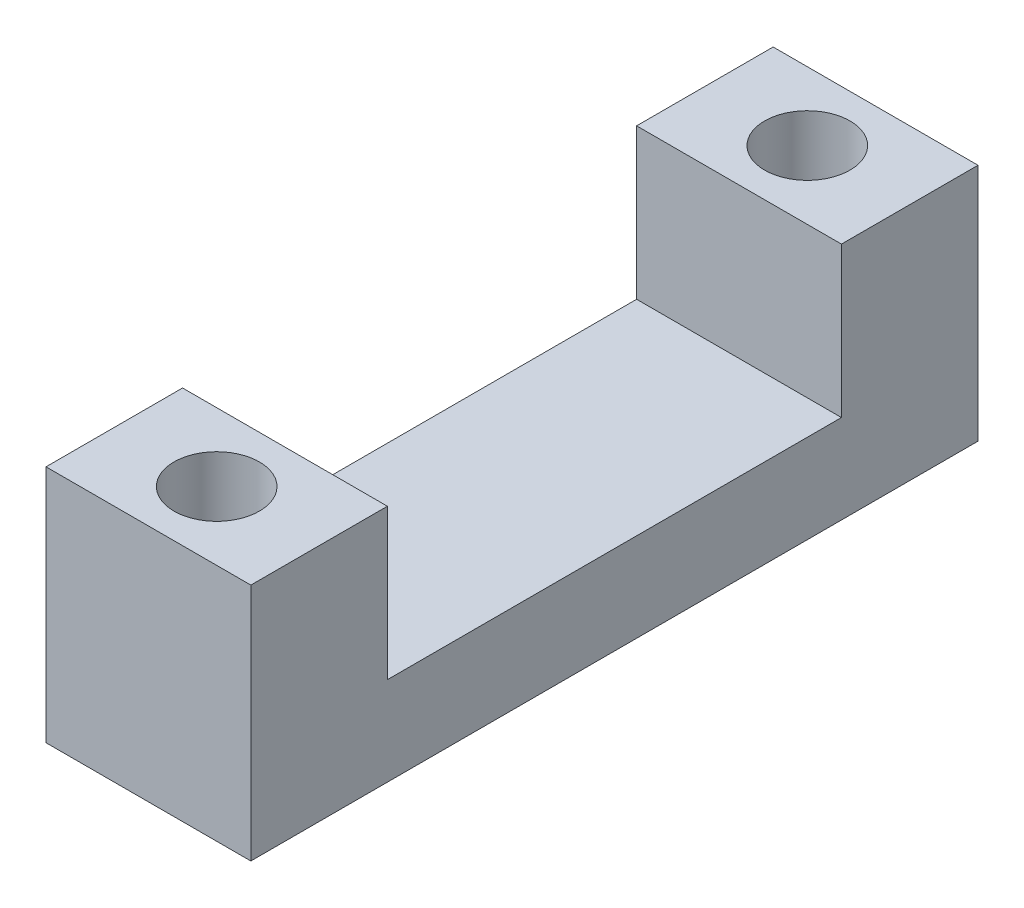
ISO-10303-21;
HEADER;
FILE_DESCRIPTION(('STEP AP214'),'2;1');
FILE_NAME('part.step','',(''),(''),'','','');
FILE_SCHEMA(('AUTOMOTIVE_DESIGN { 1 0 10303 214 1 1 1 1 }'));
ENDSEC;
DATA;
#1=APPLICATION_CONTEXT('core data for automotive mechanical design processes');
#2=APPLICATION_PROTOCOL_DEFINITION('international standard','automotive_design',2000,#1);
#3=PRODUCT_CONTEXT('',#1,'mechanical');
#4=PRODUCT('Part','Part','',(#3));
#5=PRODUCT_RELATED_PRODUCT_CATEGORY('part','',(#4));
#6=PRODUCT_DEFINITION_FORMATION('','',#4);
#7=PRODUCT_DEFINITION_CONTEXT('part definition',#1,'design');
#8=PRODUCT_DEFINITION('design','',#6,#7);
#9=PRODUCT_DEFINITION_SHAPE('','',#8);
#10=(LENGTH_UNIT() NAMED_UNIT(*) SI_UNIT(.MILLI.,.METRE.));
#11=(NAMED_UNIT(*) PLANE_ANGLE_UNIT() SI_UNIT($,.RADIAN.));
#12=(NAMED_UNIT(*) SI_UNIT($,.STERADIAN.) SOLID_ANGLE_UNIT());
#13=UNCERTAINTY_MEASURE_WITH_UNIT(LENGTH_MEASURE(1.E-05),#10,'distance_accuracy_value','');
#14=(GEOMETRIC_REPRESENTATION_CONTEXT(3) GLOBAL_UNCERTAINTY_ASSIGNED_CONTEXT((#13)) GLOBAL_UNIT_ASSIGNED_CONTEXT((#10,
#11,#12)) REPRESENTATION_CONTEXT('',''));
#15=CARTESIAN_POINT('',(0.,0.,0.));
#16=DIRECTION('',(0.,0.,1.));
#17=DIRECTION('',(1.,0.,0.));
#18=AXIS2_PLACEMENT_3D('',#15,#16,#17);
#19=CARTESIAN_POINT('',(6.,0.,-21.3));
#20=DIRECTION('',(0.,1.,0.));
#21=DIRECTION('',(0.,0.,1.));
#22=AXIS2_PLACEMENT_3D('',#19,#20,#21);
#23=PLANE('',#22);
#24=CARTESIAN_POINT('',(3.,0.,-2.));
#25=DIRECTION('',(0.,1.,0.));
#26=DIRECTION('',(0.,0.,1.));
#27=AXIS2_PLACEMENT_3D('',#24,#25,#26);
#28=CIRCLE('',#27,1.25);
#29=CARTESIAN_POINT('',(3.,0.,-0.750000000000001));
#30=VERTEX_POINT('',#29);
#31=EDGE_CURVE('E188',#30,#30,#28,.T.);
#32=ORIENTED_EDGE('',*,*,#31,.T.);
#33=EDGE_LOOP('',(#32));
#34=FACE_BOUND('',#33,.T.);
#35=CARTESIAN_POINT('',(3.,0.,-19.3));
#36=DIRECTION('',(0.,1.,0.));
#37=DIRECTION('',(0.,0.,1.));
#38=AXIS2_PLACEMENT_3D('',#35,#36,#37);
#39=CIRCLE('',#38,1.25);
#40=CARTESIAN_POINT('',(3.,0.,-18.05));
#41=VERTEX_POINT('',#40);
#42=EDGE_CURVE('E139',#41,#41,#39,.T.);
#43=ORIENTED_EDGE('',*,*,#42,.T.);
#44=EDGE_LOOP('',(#43));
#45=FACE_BOUND('',#44,.T.);
#46=DIRECTION('',(0.,0.,-1.));
#47=VECTOR('',#46,1.);
#48=CARTESIAN_POINT('',(0.,0.,-21.3));
#49=LINE('',#48,#47);
#50=CARTESIAN_POINT('',(0.,0.,0.));
#51=VERTEX_POINT('',#50);
#52=CARTESIAN_POINT('',(0.,0.,-21.3));
#53=VERTEX_POINT('',#52);
#54=EDGE_CURVE('E135',#51,#53,#49,.T.);
#55=ORIENTED_EDGE('',*,*,#54,.T.);
#56=DIRECTION('',(-1.,0.,0.));
#57=VECTOR('',#56,1.);
#58=CARTESIAN_POINT('',(6.,0.,-21.3));
#59=LINE('',#58,#57);
#60=CARTESIAN_POINT('',(6.,0.,-21.3));
#61=VERTEX_POINT('',#60);
#62=EDGE_CURVE('E11',#61,#53,#59,.T.);
#63=ORIENTED_EDGE('',*,*,#62,.F.);
#64=DIRECTION('',(0.,0.,-1.));
#65=VECTOR('',#64,1.);
#66=CARTESIAN_POINT('',(6.,0.,-21.3));
#67=LINE('',#66,#65);
#68=CARTESIAN_POINT('',(6.,0.,0.));
#69=VERTEX_POINT('',#68);
#70=EDGE_CURVE('E150',#69,#61,#67,.T.);
#71=ORIENTED_EDGE('',*,*,#70,.F.);
#72=DIRECTION('',(-1.,0.,0.));
#73=VECTOR('',#72,1.);
#74=CARTESIAN_POINT('',(6.,0.,0.));
#75=LINE('',#74,#73);
#76=EDGE_CURVE('E131',#69,#51,#75,.T.);
#77=ORIENTED_EDGE('',*,*,#76,.T.);
#78=EDGE_LOOP('',(#55,#63,#71,#77));
#79=FACE_BOUND('',#78,.T.);
#80=ADVANCED_FACE('F39',(#34,#45,#79),#23,.F.);
#81=CARTESIAN_POINT('',(6.,7.,-21.3));
#82=DIRECTION('',(0.,0.,1.));
#83=DIRECTION('',(0.,-1.,0.));
#84=AXIS2_PLACEMENT_3D('',#81,#82,#83);
#85=PLANE('',#84);
#86=DIRECTION('',(0.,1.,0.));
#87=VECTOR('',#86,1.);
#88=CARTESIAN_POINT('',(0.,7.,-21.3));
#89=LINE('',#88,#87);
#90=CARTESIAN_POINT('',(0.,7.,-21.3));
#91=VERTEX_POINT('',#90);
#92=EDGE_CURVE('E138',#53,#91,#89,.T.);
#93=ORIENTED_EDGE('',*,*,#92,.T.);
#94=DIRECTION('',(-1.,0.,0.));
#95=VECTOR('',#94,1.);
#96=CARTESIAN_POINT('',(6.,7.,-21.3));
#97=LINE('',#96,#95);
#98=CARTESIAN_POINT('',(6.,7.,-21.3));
#99=VERTEX_POINT('',#98);
#100=EDGE_CURVE('E47',#99,#91,#97,.T.);
#101=ORIENTED_EDGE('',*,*,#100,.F.);
#102=DIRECTION('',(0.,1.,0.));
#103=VECTOR('',#102,1.);
#104=CARTESIAN_POINT('',(6.,7.,-21.3));
#105=LINE('',#104,#103);
#106=EDGE_CURVE('E98',#61,#99,#105,.T.);
#107=ORIENTED_EDGE('',*,*,#106,.F.);
#108=ORIENTED_EDGE('',*,*,#62,.T.);
#109=EDGE_LOOP('',(#93,#101,#107,#108));
#110=FACE_BOUND('',#109,.T.);
#111=ADVANCED_FACE('F207',(#110),#85,.F.);
#112=CARTESIAN_POINT('',(6.,7.,-17.3));
#113=DIRECTION('',(0.,-1.,0.));
#114=DIRECTION('',(0.,0.,-1.));
#115=AXIS2_PLACEMENT_3D('',#112,#113,#114);
#116=PLANE('',#115);
#117=CARTESIAN_POINT('',(3.,7.,-19.3));
#118=DIRECTION('',(0.,1.,0.));
#119=DIRECTION('',(0.,0.,1.));
#120=AXIS2_PLACEMENT_3D('',#117,#118,#119);
#121=CIRCLE('',#120,1.25);
#122=CARTESIAN_POINT('',(3.,7.,-18.05));
#123=VERTEX_POINT('',#122);
#124=EDGE_CURVE('E185',#123,#123,#121,.T.);
#125=ORIENTED_EDGE('',*,*,#124,.F.);
#126=EDGE_LOOP('',(#125));
#127=FACE_BOUND('',#126,.T.);
#128=DIRECTION('',(0.,0.,1.));
#129=VECTOR('',#128,1.);
#130=CARTESIAN_POINT('',(0.,7.,-17.3));
#131=LINE('',#130,#129);
#132=CARTESIAN_POINT('',(0.,7.,-17.3));
#133=VERTEX_POINT('',#132);
#134=EDGE_CURVE('E141',#91,#133,#131,.T.);
#135=ORIENTED_EDGE('',*,*,#134,.T.);
#136=DIRECTION('',(-1.,0.,0.));
#137=VECTOR('',#136,1.);
#138=CARTESIAN_POINT('',(6.,7.,-17.3));
#139=LINE('',#138,#137);
#140=CARTESIAN_POINT('',(6.,7.,-17.3));
#141=VERTEX_POINT('',#140);
#142=EDGE_CURVE('E157',#141,#133,#139,.T.);
#143=ORIENTED_EDGE('',*,*,#142,.F.);
#144=DIRECTION('',(0.,0.,1.));
#145=VECTOR('',#144,1.);
#146=CARTESIAN_POINT('',(6.,7.,-17.3));
#147=LINE('',#146,#145);
#148=EDGE_CURVE('E165',#99,#141,#147,.T.);
#149=ORIENTED_EDGE('',*,*,#148,.F.);
#150=ORIENTED_EDGE('',*,*,#100,.T.);
#151=EDGE_LOOP('',(#135,#143,#149,#150));
#152=FACE_BOUND('',#151,.T.);
#153=ADVANCED_FACE('F163',(#127,#152),#116,.F.);
#154=CARTESIAN_POINT('',(6.,2.6,-17.3));
#155=DIRECTION('',(0.,0.,-1.));
#156=DIRECTION('',(-1.,0.,0.));
#157=AXIS2_PLACEMENT_3D('',#154,#155,#156);
#158=PLANE('',#157);
#159=DIRECTION('',(0.,-1.,0.));
#160=VECTOR('',#159,1.);
#161=CARTESIAN_POINT('',(0.,2.6,-17.3));
#162=LINE('',#161,#160);
#163=CARTESIAN_POINT('',(0.,2.6,-17.3));
#164=VERTEX_POINT('',#163);
#165=EDGE_CURVE('E143',#133,#164,#162,.T.);
#166=ORIENTED_EDGE('',*,*,#165,.T.);
#167=DIRECTION('',(-1.,0.,0.));
#168=VECTOR('',#167,1.);
#169=CARTESIAN_POINT('',(6.,2.6,-17.3));
#170=LINE('',#169,#168);
#171=CARTESIAN_POINT('',(6.,2.6,-17.3));
#172=VERTEX_POINT('',#171);
#173=EDGE_CURVE('E154',#172,#164,#170,.T.);
#174=ORIENTED_EDGE('',*,*,#173,.F.);
#175=DIRECTION('',(0.,-1.,0.));
#176=VECTOR('',#175,1.);
#177=CARTESIAN_POINT('',(6.,2.6,-17.3));
#178=LINE('',#177,#176);
#179=EDGE_CURVE('E177',#141,#172,#178,.T.);
#180=ORIENTED_EDGE('',*,*,#179,.F.);
#181=ORIENTED_EDGE('',*,*,#142,.T.);
#182=EDGE_LOOP('',(#166,#174,#180,#181));
#183=FACE_BOUND('',#182,.T.);
#184=ADVANCED_FACE('F173',(#183),#158,.F.);
#185=CARTESIAN_POINT('',(6.,2.6,-4.));
#186=DIRECTION('',(0.,-1.,0.));
#187=DIRECTION('',(0.,0.,-1.));
#188=AXIS2_PLACEMENT_3D('',#185,#186,#187);
#189=PLANE('',#188);
#190=DIRECTION('',(0.,0.,1.));
#191=VECTOR('',#190,1.);
#192=CARTESIAN_POINT('',(0.,2.6,-4.));
#193=LINE('',#192,#191);
#194=CARTESIAN_POINT('',(0.,2.6,-4.));
#195=VERTEX_POINT('',#194);
#196=EDGE_CURVE('E145',#164,#195,#193,.T.);
#197=ORIENTED_EDGE('',*,*,#196,.T.);
#198=DIRECTION('',(-1.,0.,0.));
#199=VECTOR('',#198,1.);
#200=CARTESIAN_POINT('',(6.,2.6,-4.));
#201=LINE('',#200,#199);
#202=CARTESIAN_POINT('',(6.,2.6,-4.));
#203=VERTEX_POINT('',#202);
#204=EDGE_CURVE('E126',#203,#195,#201,.T.);
#205=ORIENTED_EDGE('',*,*,#204,.F.);
#206=DIRECTION('',(0.,0.,1.));
#207=VECTOR('',#206,1.);
#208=CARTESIAN_POINT('',(6.,2.6,-4.));
#209=LINE('',#208,#207);
#210=EDGE_CURVE('E117',#172,#203,#209,.T.);
#211=ORIENTED_EDGE('',*,*,#210,.F.);
#212=ORIENTED_EDGE('',*,*,#173,.T.);
#213=EDGE_LOOP('',(#197,#205,#211,#212));
#214=FACE_BOUND('',#213,.T.);
#215=ADVANCED_FACE('F176',(#214),#189,.F.);
#216=CARTESIAN_POINT('',(6.,7.,-4.));
#217=DIRECTION('',(0.,0.,1.));
#218=DIRECTION('',(0.,-1.,0.));
#219=AXIS2_PLACEMENT_3D('',#216,#217,#218);
#220=PLANE('',#219);
#221=DIRECTION('',(0.,1.,0.));
#222=VECTOR('',#221,1.);
#223=CARTESIAN_POINT('',(0.,7.,-4.));
#224=LINE('',#223,#222);
#225=CARTESIAN_POINT('',(0.,7.,-4.));
#226=VERTEX_POINT('',#225);
#227=EDGE_CURVE('E125',#195,#226,#224,.T.);
#228=ORIENTED_EDGE('',*,*,#227,.T.);
#229=DIRECTION('',(-1.,0.,0.));
#230=VECTOR('',#229,1.);
#231=CARTESIAN_POINT('',(6.,7.,-4.));
#232=LINE('',#231,#230);
#233=CARTESIAN_POINT('',(6.,7.,-4.));
#234=VERTEX_POINT('',#233);
#235=EDGE_CURVE('E122',#234,#226,#232,.T.);
#236=ORIENTED_EDGE('',*,*,#235,.F.);
#237=DIRECTION('',(0.,1.,0.));
#238=VECTOR('',#237,1.);
#239=CARTESIAN_POINT('',(6.,7.,-4.));
#240=LINE('',#239,#238);
#241=EDGE_CURVE('E111',#203,#234,#240,.T.);
#242=ORIENTED_EDGE('',*,*,#241,.F.);
#243=ORIENTED_EDGE('',*,*,#204,.T.);
#244=EDGE_LOOP('',(#228,#236,#242,#243));
#245=FACE_BOUND('',#244,.T.);
#246=ADVANCED_FACE('F123',(#245),#220,.F.);
#247=CARTESIAN_POINT('',(6.,7.,0.));
#248=DIRECTION('',(0.,-1.,0.));
#249=DIRECTION('',(0.,0.,-1.));
#250=AXIS2_PLACEMENT_3D('',#247,#248,#249);
#251=PLANE('',#250);
#252=CARTESIAN_POINT('',(3.,7.,-2.));
#253=DIRECTION('',(0.,1.,0.));
#254=DIRECTION('',(0.,0.,1.));
#255=AXIS2_PLACEMENT_3D('',#252,#253,#254);
#256=CIRCLE('',#255,1.25);
#257=CARTESIAN_POINT('',(3.,7.,-0.750000000000001));
#258=VERTEX_POINT('',#257);
#259=EDGE_CURVE('E191',#258,#258,#256,.T.);
#260=ORIENTED_EDGE('',*,*,#259,.F.);
#261=EDGE_LOOP('',(#260));
#262=FACE_BOUND('',#261,.T.);
#263=DIRECTION('',(0.,0.,1.));
#264=VECTOR('',#263,1.);
#265=CARTESIAN_POINT('',(0.,7.,0.));
#266=LINE('',#265,#264);
#267=CARTESIAN_POINT('',(0.,7.,0.));
#268=VERTEX_POINT('',#267);
#269=EDGE_CURVE('E84',#226,#268,#266,.T.);
#270=ORIENTED_EDGE('',*,*,#269,.T.);
#271=DIRECTION('',(-1.,0.,0.));
#272=VECTOR('',#271,1.);
#273=CARTESIAN_POINT('',(6.,7.,0.));
#274=LINE('',#273,#272);
#275=CARTESIAN_POINT('',(6.,7.,0.));
#276=VERTEX_POINT('',#275);
#277=EDGE_CURVE('E127',#276,#268,#274,.T.);
#278=ORIENTED_EDGE('',*,*,#277,.F.);
#279=DIRECTION('',(0.,0.,1.));
#280=VECTOR('',#279,1.);
#281=CARTESIAN_POINT('',(6.,7.,0.));
#282=LINE('',#281,#280);
#283=EDGE_CURVE('E115',#234,#276,#282,.T.);
#284=ORIENTED_EDGE('',*,*,#283,.F.);
#285=ORIENTED_EDGE('',*,*,#235,.T.);
#286=EDGE_LOOP('',(#270,#278,#284,#285));
#287=FACE_BOUND('',#286,.T.);
#288=ADVANCED_FACE('F129',(#262,#287),#251,.F.);
#289=CARTESIAN_POINT('',(6.,0.,0.));
#290=DIRECTION('',(0.,0.,-1.));
#291=DIRECTION('',(0.,1.,0.));
#292=AXIS2_PLACEMENT_3D('',#289,#290,#291);
#293=PLANE('',#292);
#294=DIRECTION('',(0.,-1.,0.));
#295=VECTOR('',#294,1.);
#296=CARTESIAN_POINT('',(0.,0.,0.));
#297=LINE('',#296,#295);
#298=EDGE_CURVE('E90',#268,#51,#297,.T.);
#299=ORIENTED_EDGE('',*,*,#298,.T.);
#300=ORIENTED_EDGE('',*,*,#76,.F.);
#301=DIRECTION('',(0.,-1.,0.));
#302=VECTOR('',#301,1.);
#303=CARTESIAN_POINT('',(6.,0.,0.));
#304=LINE('',#303,#302);
#305=EDGE_CURVE('E55',#276,#69,#304,.T.);
#306=ORIENTED_EDGE('',*,*,#305,.F.);
#307=ORIENTED_EDGE('',*,*,#277,.T.);
#308=EDGE_LOOP('',(#299,#300,#306,#307));
#309=FACE_BOUND('',#308,.T.);
#310=ADVANCED_FACE('F198',(#309),#293,.F.);
#311=CARTESIAN_POINT('',(6.,0.,0.));
#312=DIRECTION('',(-1.,0.,0.));
#313=DIRECTION('',(0.,0.,1.));
#314=AXIS2_PLACEMENT_3D('',#311,#312,#313);
#315=PLANE('',#314);
#316=ORIENTED_EDGE('',*,*,#70,.T.);
#317=ORIENTED_EDGE('',*,*,#106,.T.);
#318=ORIENTED_EDGE('',*,*,#148,.T.);
#319=ORIENTED_EDGE('',*,*,#179,.T.);
#320=ORIENTED_EDGE('',*,*,#210,.T.);
#321=ORIENTED_EDGE('',*,*,#241,.T.);
#322=ORIENTED_EDGE('',*,*,#283,.T.);
#323=ORIENTED_EDGE('',*,*,#305,.T.);
#324=EDGE_LOOP('',(#316,#317,#318,#319,#320,#321,#322,#323));
#325=FACE_BOUND('',#324,.T.);
#326=ADVANCED_FACE('F113',(#325),#315,.F.);
#327=CARTESIAN_POINT('',(0.,0.,0.));
#328=DIRECTION('',(-1.,0.,0.));
#329=DIRECTION('',(0.,0.,1.));
#330=AXIS2_PLACEMENT_3D('',#327,#328,#329);
#331=PLANE('',#330);
#332=ORIENTED_EDGE('',*,*,#54,.F.);
#333=ORIENTED_EDGE('',*,*,#298,.F.);
#334=ORIENTED_EDGE('',*,*,#269,.F.);
#335=ORIENTED_EDGE('',*,*,#227,.F.);
#336=ORIENTED_EDGE('',*,*,#196,.F.);
#337=ORIENTED_EDGE('',*,*,#165,.F.);
#338=ORIENTED_EDGE('',*,*,#134,.F.);
#339=ORIENTED_EDGE('',*,*,#92,.F.);
#340=EDGE_LOOP('',(#332,#333,#334,#335,#336,#337,#338,#339));
#341=FACE_BOUND('',#340,.T.);
#342=ADVANCED_FACE('F169',(#341),#331,.T.);
#343=CARTESIAN_POINT('',(3.,7.,-19.3));
#344=DIRECTION('',(0.,1.,0.));
#345=DIRECTION('',(0.,0.,1.));
#346=AXIS2_PLACEMENT_3D('',#343,#344,#345);
#347=CYLINDRICAL_SURFACE('',#346,1.25);
#348=ORIENTED_EDGE('',*,*,#42,.F.);
#349=EDGE_LOOP('',(#348));
#350=FACE_BOUND('',#349,.T.);
#351=ORIENTED_EDGE('',*,*,#124,.T.);
#352=EDGE_LOOP('',(#351));
#353=FACE_BOUND('',#352,.T.);
#354=ADVANCED_FACE('F219',(#350,#353),#347,.F.);
#355=CARTESIAN_POINT('',(3.,7.,-2.));
#356=DIRECTION('',(0.,1.,0.));
#357=DIRECTION('',(0.,0.,1.));
#358=AXIS2_PLACEMENT_3D('',#355,#356,#357);
#359=CYLINDRICAL_SURFACE('',#358,1.25);
#360=ORIENTED_EDGE('',*,*,#31,.F.);
#361=EDGE_LOOP('',(#360));
#362=FACE_BOUND('',#361,.T.);
#363=ORIENTED_EDGE('',*,*,#259,.T.);
#364=EDGE_LOOP('',(#363));
#365=FACE_BOUND('',#364,.T.);
#366=ADVANCED_FACE('F195',(#362,#365),#359,.F.);
#367=CLOSED_SHELL('',(#80,#111,#153,#184,#215,#246,#288,#310,#326,#342,#354,#366));
#368=MANIFOLD_SOLID_BREP('B2',#367);
#369=ADVANCED_BREP_SHAPE_REPRESENTATION('',(#18,#368),#14);
#370=SHAPE_DEFINITION_REPRESENTATION(#9,#369);
ENDSEC;
END-ISO-10303-21;
